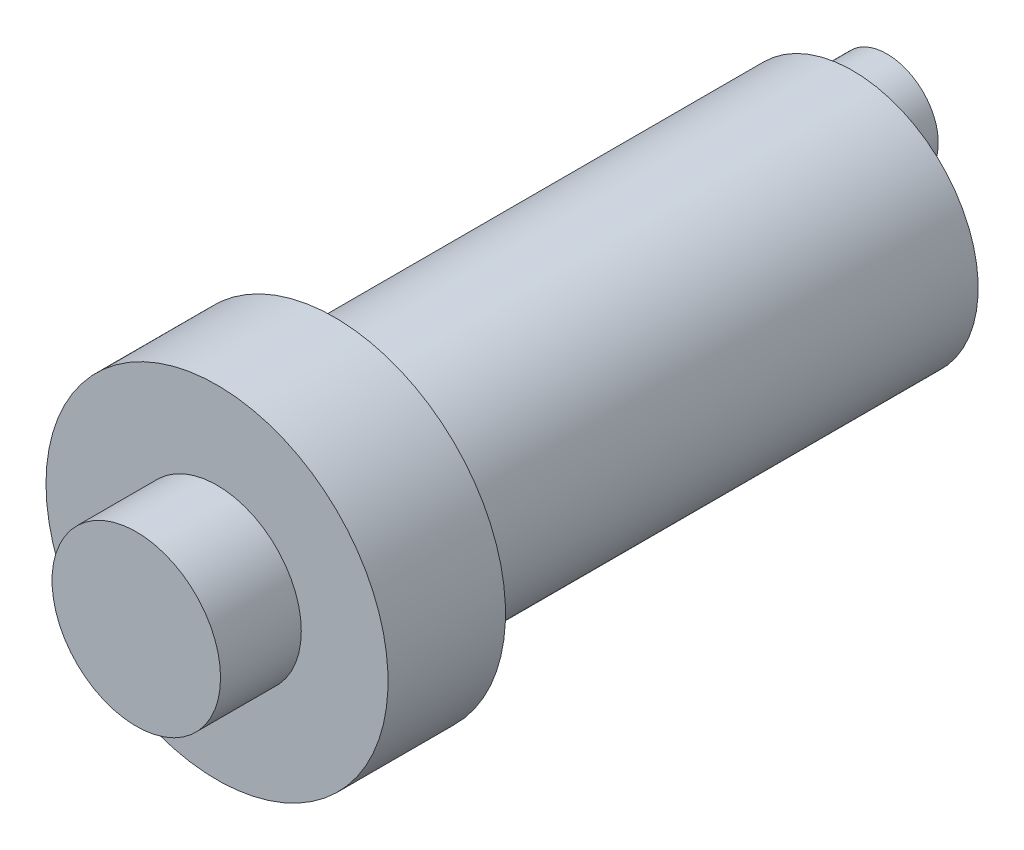
ISO-10303-21;
HEADER;
FILE_DESCRIPTION(('STEP AP214'),'2;1');
FILE_NAME('part.step','',(''),(''),'','','');
FILE_SCHEMA(('AUTOMOTIVE_DESIGN { 1 0 10303 214 1 1 1 1 }'));
ENDSEC;
DATA;
#1=APPLICATION_CONTEXT('core data for automotive mechanical design processes');
#2=APPLICATION_PROTOCOL_DEFINITION('international standard','automotive_design',2000,#1);
#3=PRODUCT_CONTEXT('',#1,'mechanical');
#4=PRODUCT('Part','Part','',(#3));
#5=PRODUCT_RELATED_PRODUCT_CATEGORY('part','',(#4));
#6=PRODUCT_DEFINITION_FORMATION('','',#4);
#7=PRODUCT_DEFINITION_CONTEXT('part definition',#1,'design');
#8=PRODUCT_DEFINITION('design','',#6,#7);
#9=PRODUCT_DEFINITION_SHAPE('','',#8);
#10=(LENGTH_UNIT() NAMED_UNIT(*) SI_UNIT(.MILLI.,.METRE.));
#11=(NAMED_UNIT(*) PLANE_ANGLE_UNIT() SI_UNIT($,.RADIAN.));
#12=(NAMED_UNIT(*) SI_UNIT($,.STERADIAN.) SOLID_ANGLE_UNIT());
#13=UNCERTAINTY_MEASURE_WITH_UNIT(LENGTH_MEASURE(1.E-05),#10,'distance_accuracy_value','');
#14=(GEOMETRIC_REPRESENTATION_CONTEXT(3) GLOBAL_UNCERTAINTY_ASSIGNED_CONTEXT((#13)) GLOBAL_UNIT_ASSIGNED_CONTEXT((#10,
#11,#12)) REPRESENTATION_CONTEXT('',''));
#15=CARTESIAN_POINT('',(0.,0.,0.));
#16=DIRECTION('',(0.,0.,1.));
#17=DIRECTION('',(1.,0.,0.));
#18=AXIS2_PLACEMENT_3D('',#15,#16,#17);
#19=CARTESIAN_POINT('',(0.,0.,5.5));
#20=DIRECTION('',(0.,0.,-1.));
#21=DIRECTION('',(-1.,0.,0.));
#22=AXIS2_PLACEMENT_3D('',#19,#20,#21);
#23=CYLINDRICAL_SURFACE('',#22,5.74);
#24=CARTESIAN_POINT('',(0.,0.,5.5));
#25=DIRECTION('',(0.,0.,1.));
#26=DIRECTION('',(1.,0.,0.));
#27=AXIS2_PLACEMENT_3D('',#24,#25,#26);
#28=CIRCLE('',#27,5.74);
#29=CARTESIAN_POINT('',(5.74,0.,5.5));
#30=VERTEX_POINT('',#29);
#31=EDGE_CURVE('E38',#30,#30,#28,.T.);
#32=ORIENTED_EDGE('',*,*,#31,.F.);
#33=EDGE_LOOP('',(#32));
#34=FACE_BOUND('',#33,.T.);
#35=CARTESIAN_POINT('',(0.,0.,0.));
#36=DIRECTION('',(0.,0.,1.));
#37=DIRECTION('',(1.,0.,0.));
#38=AXIS2_PLACEMENT_3D('',#35,#36,#37);
#39=CIRCLE('',#38,5.74);
#40=CARTESIAN_POINT('',(5.74,0.,0.));
#41=VERTEX_POINT('',#40);
#42=EDGE_CURVE('E34',#41,#41,#39,.T.);
#43=ORIENTED_EDGE('',*,*,#42,.T.);
#44=EDGE_LOOP('',(#43));
#45=FACE_BOUND('',#44,.T.);
#46=ADVANCED_FACE('F31',(#34,#45),#23,.T.);
#47=CARTESIAN_POINT('',(0.,0.,5.5));
#48=DIRECTION('',(0.,0.,1.));
#49=DIRECTION('',(1.,0.,0.));
#50=AXIS2_PLACEMENT_3D('',#47,#48,#49);
#51=PLANE('',#50);
#52=ORIENTED_EDGE('',*,*,#31,.T.);
#53=EDGE_LOOP('',(#52));
#54=FACE_BOUND('',#53,.T.);
#55=ADVANCED_FACE('F83',(#54),#51,.T.);
#56=CARTESIAN_POINT('',(0.,0.,-8.));
#57=DIRECTION('',(0.,0.,1.));
#58=DIRECTION('',(1.,0.,0.));
#59=AXIS2_PLACEMENT_3D('',#56,#57,#58);
#60=CYLINDRICAL_SURFACE('',#59,11.65);
#61=CARTESIAN_POINT('',(0.,0.,-8.));
#62=DIRECTION('',(0.,0.,-1.));
#63=DIRECTION('',(-1.,0.,0.));
#64=AXIS2_PLACEMENT_3D('',#61,#62,#63);
#65=CIRCLE('',#64,11.65);
#66=CARTESIAN_POINT('',(-11.65,0.,-8.));
#67=VERTEX_POINT('',#66);
#68=EDGE_CURVE('E47',#67,#67,#65,.T.);
#69=ORIENTED_EDGE('',*,*,#68,.F.);
#70=EDGE_LOOP('',(#69));
#71=FACE_BOUND('',#70,.T.);
#72=CARTESIAN_POINT('',(0.,0.,0.));
#73=DIRECTION('',(0.,0.,-1.));
#74=DIRECTION('',(-1.,0.,0.));
#75=AXIS2_PLACEMENT_3D('',#72,#73,#74);
#76=CIRCLE('',#75,11.65);
#77=CARTESIAN_POINT('',(-11.65,0.,0.));
#78=VERTEX_POINT('',#77);
#79=EDGE_CURVE('E50',#78,#78,#76,.T.);
#80=ORIENTED_EDGE('',*,*,#79,.T.);
#81=EDGE_LOOP('',(#80));
#82=FACE_BOUND('',#81,.T.);
#83=ADVANCED_FACE('F88',(#71,#82),#60,.T.);
#84=CARTESIAN_POINT('',(0.,0.,-8.));
#85=DIRECTION('',(0.,0.,-1.));
#86=DIRECTION('',(-1.,0.,0.));
#87=AXIS2_PLACEMENT_3D('',#84,#85,#86);
#88=PLANE('',#87);
#89=CARTESIAN_POINT('',(0.,0.,-8.));
#90=DIRECTION('',(0.,0.,-1.));
#91=DIRECTION('',(-1.,0.,0.));
#92=AXIS2_PLACEMENT_3D('',#89,#90,#91);
#93=CIRCLE('',#92,8.55);
#94=CARTESIAN_POINT('',(-8.55,0.,-8.));
#95=VERTEX_POINT('',#94);
#96=EDGE_CURVE('E10',#95,#95,#93,.T.);
#97=ORIENTED_EDGE('',*,*,#96,.F.);
#98=EDGE_LOOP('',(#97));
#99=FACE_BOUND('',#98,.T.);
#100=ORIENTED_EDGE('',*,*,#68,.T.);
#101=EDGE_LOOP('',(#100));
#102=FACE_BOUND('',#101,.T.);
#103=ADVANCED_FACE('F97',(#99,#102),#88,.T.);
#104=CARTESIAN_POINT('',(0.,0.,0.));
#105=DIRECTION('',(0.,0.,-1.));
#106=DIRECTION('',(-1.,0.,0.));
#107=AXIS2_PLACEMENT_3D('',#104,#105,#106);
#108=PLANE('',#107);
#109=ORIENTED_EDGE('',*,*,#42,.F.);
#110=EDGE_LOOP('',(#109));
#111=FACE_BOUND('',#110,.T.);
#112=ORIENTED_EDGE('',*,*,#79,.F.);
#113=EDGE_LOOP('',(#112));
#114=FACE_BOUND('',#113,.T.);
#115=ADVANCED_FACE('F79',(#111,#114),#108,.F.);
#116=CARTESIAN_POINT('',(0.,0.,-43.3));
#117=DIRECTION('',(0.,0.,1.));
#118=DIRECTION('',(1.,0.,0.));
#119=AXIS2_PLACEMENT_3D('',#116,#117,#118);
#120=CYLINDRICAL_SURFACE('',#119,8.55);
#121=CARTESIAN_POINT('',(0.,0.,-43.3));
#122=DIRECTION('',(0.,0.,-1.));
#123=DIRECTION('',(-1.,0.,0.));
#124=AXIS2_PLACEMENT_3D('',#121,#122,#123);
#125=CIRCLE('',#124,8.55);
#126=CARTESIAN_POINT('',(-8.55,0.,-43.3));
#127=VERTEX_POINT('',#126);
#128=EDGE_CURVE('E45',#127,#127,#125,.T.);
#129=ORIENTED_EDGE('',*,*,#128,.F.);
#130=EDGE_LOOP('',(#129));
#131=FACE_BOUND('',#130,.T.);
#132=ORIENTED_EDGE('',*,*,#96,.T.);
#133=EDGE_LOOP('',(#132));
#134=FACE_BOUND('',#133,.T.);
#135=ADVANCED_FACE('F70',(#131,#134),#120,.T.);
#136=CARTESIAN_POINT('',(0.,0.,-43.3));
#137=DIRECTION('',(0.,0.,-1.));
#138=DIRECTION('',(-1.,0.,0.));
#139=AXIS2_PLACEMENT_3D('',#136,#137,#138);
#140=PLANE('',#139);
#141=CARTESIAN_POINT('',(-4.86533222401654,0.,-43.3));
#142=DIRECTION('',(0.,0.,-1.));
#143=DIRECTION('',(-1.,0.,0.));
#144=AXIS2_PLACEMENT_3D('',#141,#142,#143);
#145=CIRCLE('',#144,3.5);
#146=CARTESIAN_POINT('',(-8.36533222401654,0.,-43.3));
#147=VERTEX_POINT('',#146);
#148=EDGE_CURVE('E59',#147,#147,#145,.T.);
#149=ORIENTED_EDGE('',*,*,#148,.F.);
#150=EDGE_LOOP('',(#149));
#151=FACE_BOUND('',#150,.T.);
#152=ORIENTED_EDGE('',*,*,#128,.T.);
#153=EDGE_LOOP('',(#152));
#154=FACE_BOUND('',#153,.T.);
#155=ADVANCED_FACE('F68',(#151,#154),#140,.T.);
#156=CARTESIAN_POINT('',(-4.86533222401654,0.,-50.5));
#157=DIRECTION('',(0.,0.,1.));
#158=DIRECTION('',(1.,0.,0.));
#159=AXIS2_PLACEMENT_3D('',#156,#157,#158);
#160=CYLINDRICAL_SURFACE('',#159,3.5);
#161=CARTESIAN_POINT('',(-4.86533222401654,0.,-50.5));
#162=DIRECTION('',(0.,0.,-1.));
#163=DIRECTION('',(-1.,0.,0.));
#164=AXIS2_PLACEMENT_3D('',#161,#162,#163);
#165=CIRCLE('',#164,3.5);
#166=CARTESIAN_POINT('',(-8.36533222401654,0.,-50.5));
#167=VERTEX_POINT('',#166);
#168=EDGE_CURVE('E55',#167,#167,#165,.T.);
#169=ORIENTED_EDGE('',*,*,#168,.F.);
#170=EDGE_LOOP('',(#169));
#171=FACE_BOUND('',#170,.T.);
#172=ORIENTED_EDGE('',*,*,#148,.T.);
#173=EDGE_LOOP('',(#172));
#174=FACE_BOUND('',#173,.T.);
#175=ADVANCED_FACE('F66',(#171,#174),#160,.T.);
#176=CARTESIAN_POINT('',(-4.86533222401654,0.,-50.5));
#177=DIRECTION('',(0.,0.,-1.));
#178=DIRECTION('',(-1.,0.,0.));
#179=AXIS2_PLACEMENT_3D('',#176,#177,#178);
#180=PLANE('',#179);
#181=ORIENTED_EDGE('',*,*,#168,.T.);
#182=EDGE_LOOP('',(#181));
#183=FACE_BOUND('',#182,.T.);
#184=ADVANCED_FACE('F76',(#183),#180,.T.);
#185=CLOSED_SHELL('',(#46,#55,#83,#103,#115,#135,#155,#175,#184));
#186=MANIFOLD_SOLID_BREP('B2',#185);
#187=ADVANCED_BREP_SHAPE_REPRESENTATION('',(#18,#186),#14);
#188=SHAPE_DEFINITION_REPRESENTATION(#9,#187);
ENDSEC;
END-ISO-10303-21;
